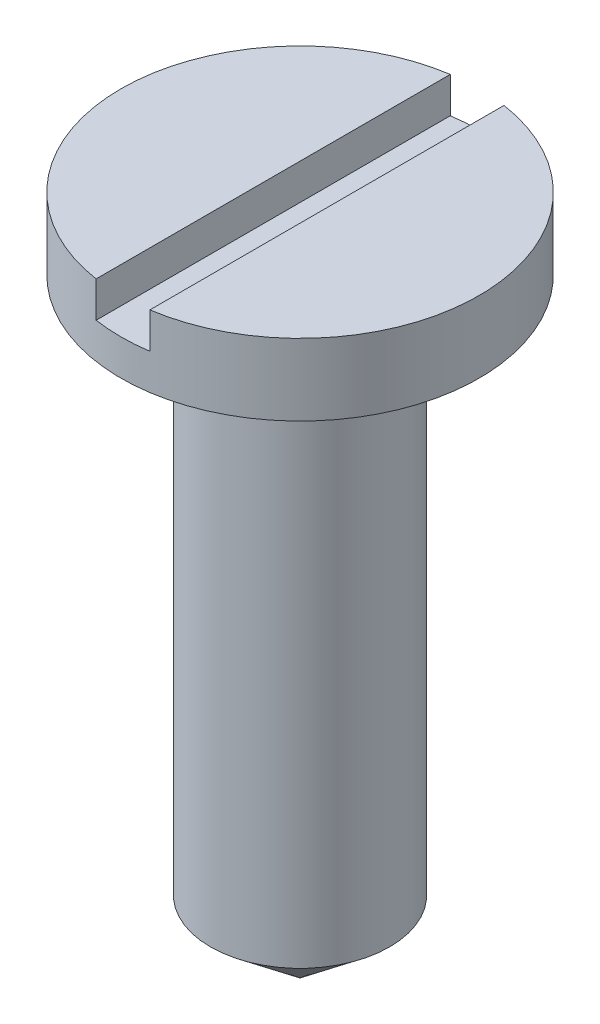
ISO-10303-21;
HEADER;
FILE_DESCRIPTION(('STEP AP214'),'2;1');
FILE_NAME('part.step','',(''),(''),'','','');
FILE_SCHEMA(('AUTOMOTIVE_DESIGN { 1 0 10303 214 1 1 1 1 }'));
ENDSEC;
DATA;
#1=APPLICATION_CONTEXT('core data for automotive mechanical design processes');
#2=APPLICATION_PROTOCOL_DEFINITION('international standard','automotive_design',2000,#1);
#3=PRODUCT_CONTEXT('',#1,'mechanical');
#4=PRODUCT('Part','Part','',(#3));
#5=PRODUCT_RELATED_PRODUCT_CATEGORY('part','',(#4));
#6=PRODUCT_DEFINITION_FORMATION('','',#4);
#7=PRODUCT_DEFINITION_CONTEXT('part definition',#1,'design');
#8=PRODUCT_DEFINITION('design','',#6,#7);
#9=PRODUCT_DEFINITION_SHAPE('','',#8);
#10=(LENGTH_UNIT() NAMED_UNIT(*) SI_UNIT(.MILLI.,.METRE.));
#11=(NAMED_UNIT(*) PLANE_ANGLE_UNIT() SI_UNIT($,.RADIAN.));
#12=(NAMED_UNIT(*) SI_UNIT($,.STERADIAN.) SOLID_ANGLE_UNIT());
#13=UNCERTAINTY_MEASURE_WITH_UNIT(LENGTH_MEASURE(1.E-05),#10,'distance_accuracy_value','');
#14=(GEOMETRIC_REPRESENTATION_CONTEXT(3) GLOBAL_UNCERTAINTY_ASSIGNED_CONTEXT((#13)) GLOBAL_UNIT_ASSIGNED_CONTEXT((#10,
#11,#12)) REPRESENTATION_CONTEXT('',''));
#15=CARTESIAN_POINT('',(0.,0.,0.));
#16=DIRECTION('',(0.,0.,1.));
#17=DIRECTION('',(1.,0.,0.));
#18=AXIS2_PLACEMENT_3D('',#15,#16,#17);
#19=CARTESIAN_POINT('',(2.5,17.,0.));
#20=DIRECTION('',(0.,-1.,0.));
#21=DIRECTION('',(1.,0.,0.));
#22=AXIS2_PLACEMENT_3D('',#19,#20,#21);
#23=PLANE('',#22);
#24=CARTESIAN_POINT('',(-2.5,17.,0.));
#25=DIRECTION('',(0.,1.,0.));
#26=DIRECTION('',(-1.,0.,0.));
#27=AXIS2_PLACEMENT_3D('',#24,#25,#26);
#28=CIRCLE('',#27,5.);
#29=CARTESIAN_POINT('',(-1.75,17.,4.94342998332129));
#30=VERTEX_POINT('',#29);
#31=CARTESIAN_POINT('',(-1.75,17.,-4.94342998332129));
#32=VERTEX_POINT('',#31);
#33=EDGE_CURVE('E126',#30,#32,#28,.T.);
#34=ORIENTED_EDGE('',*,*,#33,.T.);
#35=DIRECTION('',(0.,0.,1.));
#36=VECTOR('',#35,1.);
#37=CARTESIAN_POINT('',(-1.75,17.,0.));
#38=LINE('',#37,#36);
#39=EDGE_CURVE('E145',#32,#30,#38,.T.);
#40=ORIENTED_EDGE('',*,*,#39,.T.);
#41=EDGE_LOOP('',(#34,#40));
#42=FACE_BOUND('',#41,.T.);
#43=ADVANCED_FACE('F43',(#42),#23,.F.);
#44=CARTESIAN_POINT('',(-2.5,17.,0.));
#45=DIRECTION('',(0.,1.,0.));
#46=DIRECTION('',(-1.,0.,0.));
#47=AXIS2_PLACEMENT_3D('',#44,#45,#46);
#48=CYLINDRICAL_SURFACE('',#47,2.5);
#49=CARTESIAN_POINT('',(-2.5,15.,0.));
#50=DIRECTION('',(0.,1.,0.));
#51=DIRECTION('',(-1.,0.,0.));
#52=AXIS2_PLACEMENT_3D('',#49,#50,#51);
#53=CIRCLE('',#52,2.5);
#54=CARTESIAN_POINT('',(-5.00000000000001,15.,0.));
#55=VERTEX_POINT('',#54);
#56=EDGE_CURVE('E140',#55,#55,#53,.T.);
#57=ORIENTED_EDGE('',*,*,#56,.F.);
#58=EDGE_LOOP('',(#57));
#59=FACE_BOUND('',#58,.T.);
#60=CARTESIAN_POINT('',(-2.5,0.,0.));
#61=DIRECTION('',(0.,1.,0.));
#62=DIRECTION('',(0.,0.,1.));
#63=AXIS2_PLACEMENT_3D('',#60,#61,#62);
#64=CIRCLE('',#63,2.5);
#65=CARTESIAN_POINT('',(-2.5,0.,2.5));
#66=VERTEX_POINT('',#65);
#67=EDGE_CURVE('E164',#66,#66,#64,.T.);
#68=ORIENTED_EDGE('',*,*,#67,.T.);
#69=EDGE_LOOP('',(#68));
#70=FACE_BOUND('',#69,.T.);
#71=ADVANCED_FACE('F45',(#59,#70),#48,.T.);
#72=CARTESIAN_POINT('',(0.,15.,0.));
#73=DIRECTION('',(0.,1.,0.));
#74=DIRECTION('',(-1.,0.,0.));
#75=AXIS2_PLACEMENT_3D('',#72,#73,#74);
#76=PLANE('',#75);
#77=CARTESIAN_POINT('',(-2.5,15.,0.));
#78=DIRECTION('',(0.,1.,0.));
#79=DIRECTION('',(-1.,0.,0.));
#80=AXIS2_PLACEMENT_3D('',#77,#78,#79);
#81=CIRCLE('',#80,5.);
#82=CARTESIAN_POINT('',(-7.5,15.,0.));
#83=VERTEX_POINT('',#82);
#84=EDGE_CURVE('E131',#83,#83,#81,.T.);
#85=ORIENTED_EDGE('',*,*,#84,.F.);
#86=EDGE_LOOP('',(#85));
#87=FACE_BOUND('',#86,.T.);
#88=ORIENTED_EDGE('',*,*,#56,.T.);
#89=EDGE_LOOP('',(#88));
#90=FACE_BOUND('',#89,.T.);
#91=ADVANCED_FACE('F106',(#87,#90),#76,.F.);
#92=CARTESIAN_POINT('',(-2.5,17.,0.));
#93=DIRECTION('',(0.,1.,0.));
#94=DIRECTION('',(-1.,0.,0.));
#95=AXIS2_PLACEMENT_3D('',#92,#93,#94);
#96=CYLINDRICAL_SURFACE('',#95,5.);
#97=CARTESIAN_POINT('',(-2.5,16.,0.));
#98=DIRECTION('',(0.,-1.,0.));
#99=DIRECTION('',(0.,0.,-1.));
#100=AXIS2_PLACEMENT_3D('',#97,#98,#99);
#101=CIRCLE('',#100,5.);
#102=CARTESIAN_POINT('',(-3.25,16.,-4.9434299833213));
#103=VERTEX_POINT('',#102);
#104=CARTESIAN_POINT('',(-1.75,16.,-4.94342998332129));
#105=VERTEX_POINT('',#104);
#106=EDGE_CURVE('E11',#103,#105,#101,.T.);
#107=ORIENTED_EDGE('',*,*,#106,.T.);
#108=DIRECTION('',(0.,1.,0.));
#109=VECTOR('',#108,1.);
#110=CARTESIAN_POINT('',(-1.75,17.,-4.94342998332129));
#111=LINE('',#110,#109);
#112=EDGE_CURVE('E127',#105,#32,#111,.T.);
#113=ORIENTED_EDGE('',*,*,#112,.T.);
#114=ORIENTED_EDGE('',*,*,#33,.F.);
#115=DIRECTION('',(0.,1.,0.));
#116=VECTOR('',#115,1.);
#117=CARTESIAN_POINT('',(-1.75,17.,4.94342998332129));
#118=LINE('',#117,#116);
#119=CARTESIAN_POINT('',(-1.75,16.,4.94342998332129));
#120=VERTEX_POINT('',#119);
#121=EDGE_CURVE('E133',#30,#120,#118,.F.);
#122=ORIENTED_EDGE('',*,*,#121,.T.);
#123=CARTESIAN_POINT('',(-3.25,16.,4.9434299833213));
#124=VERTEX_POINT('',#123);
#125=EDGE_CURVE('E47',#120,#124,#101,.T.);
#126=ORIENTED_EDGE('',*,*,#125,.T.);
#127=DIRECTION('',(0.,1.,0.));
#128=VECTOR('',#127,1.);
#129=CARTESIAN_POINT('',(-3.25,17.,4.9434299833213));
#130=LINE('',#129,#128);
#131=CARTESIAN_POINT('',(-3.25,17.,4.9434299833213));
#132=VERTEX_POINT('',#131);
#133=EDGE_CURVE('E152',#124,#132,#130,.T.);
#134=ORIENTED_EDGE('',*,*,#133,.T.);
#135=CARTESIAN_POINT('',(-3.25,17.,-4.9434299833213));
#136=VERTEX_POINT('',#135);
#137=EDGE_CURVE('E122',#136,#132,#28,.T.);
#138=ORIENTED_EDGE('',*,*,#137,.F.);
#139=DIRECTION('',(0.,1.,0.));
#140=VECTOR('',#139,1.);
#141=CARTESIAN_POINT('',(-3.25,17.,-4.9434299833213));
#142=LINE('',#141,#140);
#143=EDGE_CURVE('E59',#136,#103,#142,.F.);
#144=ORIENTED_EDGE('',*,*,#143,.T.);
#145=EDGE_LOOP('',(#107,#113,#114,#122,#126,#134,#138,#144));
#146=FACE_BOUND('',#145,.T.);
#147=ORIENTED_EDGE('',*,*,#84,.T.);
#148=EDGE_LOOP('',(#147));
#149=FACE_BOUND('',#148,.T.);
#150=ADVANCED_FACE('F112',(#146,#149),#96,.T.);
#151=ORIENTED_EDGE('',*,*,#137,.T.);
#152=DIRECTION('',(0.,0.,-1.));
#153=VECTOR('',#152,1.);
#154=CARTESIAN_POINT('',(-3.25,17.,0.));
#155=LINE('',#154,#153);
#156=EDGE_CURVE('E123',#132,#136,#155,.T.);
#157=ORIENTED_EDGE('',*,*,#156,.T.);
#158=EDGE_LOOP('',(#151,#157));
#159=FACE_BOUND('',#158,.T.);
#160=ADVANCED_FACE('F102',(#159),#23,.F.);
#161=CARTESIAN_POINT('',(-3.25,16.,-5.));
#162=DIRECTION('',(0.,-1.,0.));
#163=DIRECTION('',(0.,0.,-1.));
#164=AXIS2_PLACEMENT_3D('',#161,#162,#163);
#165=PLANE('',#164);
#166=DIRECTION('',(0.,0.,1.));
#167=VECTOR('',#166,1.);
#168=CARTESIAN_POINT('',(-1.75,16.,-5.));
#169=LINE('',#168,#167);
#170=EDGE_CURVE('E160',#105,#120,#169,.T.);
#171=ORIENTED_EDGE('',*,*,#170,.F.);
#172=ORIENTED_EDGE('',*,*,#106,.F.);
#173=DIRECTION('',(0.,0.,1.));
#174=VECTOR('',#173,1.);
#175=CARTESIAN_POINT('',(-3.25,16.,-5.));
#176=LINE('',#175,#174);
#177=EDGE_CURVE('E161',#103,#124,#176,.T.);
#178=ORIENTED_EDGE('',*,*,#177,.T.);
#179=ORIENTED_EDGE('',*,*,#125,.F.);
#180=EDGE_LOOP('',(#171,#172,#178,#179));
#181=FACE_BOUND('',#180,.T.);
#182=ADVANCED_FACE('F111',(#181),#165,.F.);
#183=CARTESIAN_POINT('',(-1.75,16.,-5.));
#184=DIRECTION('',(1.,0.,0.));
#185=DIRECTION('',(0.,0.,-1.));
#186=AXIS2_PLACEMENT_3D('',#183,#184,#185);
#187=PLANE('',#186);
#188=ORIENTED_EDGE('',*,*,#170,.T.);
#189=ORIENTED_EDGE('',*,*,#121,.F.);
#190=ORIENTED_EDGE('',*,*,#39,.F.);
#191=ORIENTED_EDGE('',*,*,#112,.F.);
#192=EDGE_LOOP('',(#188,#189,#190,#191));
#193=FACE_BOUND('',#192,.T.);
#194=ADVANCED_FACE('F95',(#193),#187,.F.);
#195=CARTESIAN_POINT('',(-3.25,17.,-5.));
#196=DIRECTION('',(-1.,0.,0.));
#197=DIRECTION('',(0.,0.,1.));
#198=AXIS2_PLACEMENT_3D('',#195,#196,#197);
#199=PLANE('',#198);
#200=ORIENTED_EDGE('',*,*,#177,.F.);
#201=ORIENTED_EDGE('',*,*,#143,.F.);
#202=ORIENTED_EDGE('',*,*,#156,.F.);
#203=ORIENTED_EDGE('',*,*,#133,.F.);
#204=EDGE_LOOP('',(#200,#201,#202,#203));
#205=FACE_BOUND('',#204,.T.);
#206=ADVANCED_FACE('F89',(#205),#199,.F.);
#207=CARTESIAN_POINT('',(-2.5,-2.,0.));
#208=DIRECTION('',(0.,1.,0.));
#209=DIRECTION('',(0.,0.,1.));
#210=AXIS2_PLACEMENT_3D('',#207,#208,#209);
#211=CONICAL_SURFACE('',#210,0.,0.896055384571344);
#212=ORIENTED_EDGE('',*,*,#67,.F.);
#213=EDGE_LOOP('',(#212));
#214=FACE_BOUND('',#213,.T.);
#215=CARTESIAN_POINT('',(-2.5,-2.,0.));
#216=VERTEX_POINT('',#215);
#217=VERTEX_LOOP('',#216);
#218=FACE_BOUND('',#217,.T.);
#219=ADVANCED_FACE('F87',(#214,#218),#211,.T.);
#220=CLOSED_SHELL('',(#43,#71,#91,#150,#160,#182,#194,#206,#219));
#221=MANIFOLD_SOLID_BREP('B2',#220);
#222=ADVANCED_BREP_SHAPE_REPRESENTATION('',(#18,#221),#14);
#223=SHAPE_DEFINITION_REPRESENTATION(#9,#222);
ENDSEC;
END-ISO-10303-21;
